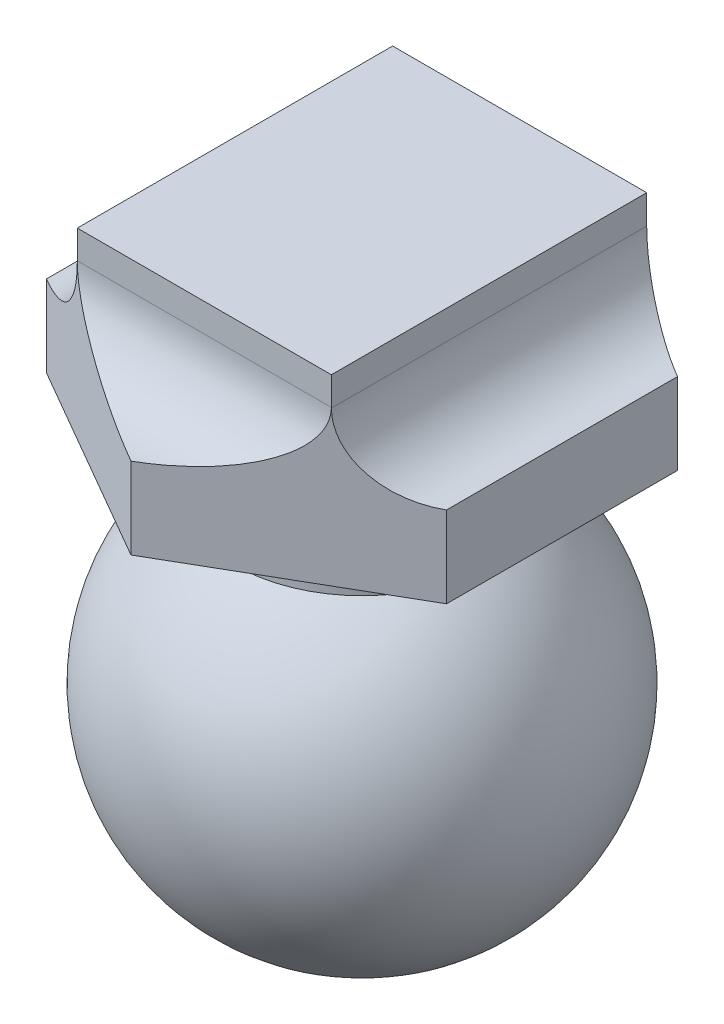
ISO-10303-21;
HEADER;
FILE_DESCRIPTION(('STEP AP214'),'2;1');
FILE_NAME('part.step','',(''),(''),'','','');
FILE_SCHEMA(('AUTOMOTIVE_DESIGN { 1 0 10303 214 1 1 1 1 }'));
ENDSEC;
DATA;
#1=APPLICATION_CONTEXT('core data for automotive mechanical design processes');
#2=APPLICATION_PROTOCOL_DEFINITION('international standard','automotive_design',2000,#1);
#3=PRODUCT_CONTEXT('',#1,'mechanical');
#4=PRODUCT('Part','Part','',(#3));
#5=PRODUCT_RELATED_PRODUCT_CATEGORY('part','',(#4));
#6=PRODUCT_DEFINITION_FORMATION('','',#4);
#7=PRODUCT_DEFINITION_CONTEXT('part definition',#1,'design');
#8=PRODUCT_DEFINITION('design','',#6,#7);
#9=PRODUCT_DEFINITION_SHAPE('','',#8);
#10=(LENGTH_UNIT() NAMED_UNIT(*) SI_UNIT(.MILLI.,.METRE.));
#11=(NAMED_UNIT(*) PLANE_ANGLE_UNIT() SI_UNIT($,.RADIAN.));
#12=(NAMED_UNIT(*) SI_UNIT($,.STERADIAN.) SOLID_ANGLE_UNIT());
#13=UNCERTAINTY_MEASURE_WITH_UNIT(LENGTH_MEASURE(1.E-05),#10,'distance_accuracy_value','');
#14=(GEOMETRIC_REPRESENTATION_CONTEXT(3) GLOBAL_UNCERTAINTY_ASSIGNED_CONTEXT((#13)) GLOBAL_UNIT_ASSIGNED_CONTEXT((#10,
#11,#12)) REPRESENTATION_CONTEXT('',''));
#15=CARTESIAN_POINT('',(0.,0.,0.));
#16=DIRECTION('',(0.,0.,1.));
#17=DIRECTION('',(1.,0.,0.));
#18=AXIS2_PLACEMENT_3D('',#15,#16,#17);
#19=CARTESIAN_POINT('',(3.175,2.54,3.9404155872192));
#20=DIRECTION('',(-1.,0.,0.));
#21=DIRECTION('',(0.,0.,1.));
#22=AXIS2_PLACEMENT_3D('',#19,#20,#21);
#23=PLANE('',#22);
#24=DIRECTION('',(0.,0.,-1.));
#25=VECTOR('',#24,1.);
#26=CARTESIAN_POINT('',(3.17499999999999,1.81694857353043,6.18803279212225));
#27=LINE('',#26,#25);
#28=CARTESIAN_POINT('',(3.175,1.81694857353043,3.9404155872192));
#29=VERTEX_POINT('',#28);
#30=CARTESIAN_POINT('',(3.17499999999999,1.81694857353043,-3.9404155872192));
#31=VERTEX_POINT('',#30);
#32=EDGE_CURVE('E159',#29,#31,#27,.T.);
#33=ORIENTED_EDGE('',*,*,#32,.T.);
#34=DIRECTION('',(0.,1.,0.));
#35=VECTOR('',#34,1.);
#36=CARTESIAN_POINT('',(3.175,1.83308710467706,-3.94041558721919));
#37=LINE('',#36,#35);
#38=CARTESIAN_POINT('',(3.175,1.83308710467706,-3.94041558721919));
#39=VERTEX_POINT('',#38);
#40=EDGE_CURVE('E146',#31,#39,#37,.T.);
#41=ORIENTED_EDGE('',*,*,#40,.T.);
#42=DIRECTION('',(0.,-1.,0.));
#43=VECTOR('',#42,1.);
#44=CARTESIAN_POINT('',(3.175,2.54,-3.94041558721919));
#45=LINE('',#44,#43);
#46=CARTESIAN_POINT('',(3.175,2.54,-3.94041558721919));
#47=VERTEX_POINT('',#46);
#48=EDGE_CURVE('E232',#47,#39,#45,.T.);
#49=ORIENTED_EDGE('',*,*,#48,.F.);
#50=DIRECTION('',(0.,0.,-1.));
#51=VECTOR('',#50,1.);
#52=CARTESIAN_POINT('',(3.175,2.54,3.9404155872192));
#53=LINE('',#52,#51);
#54=CARTESIAN_POINT('',(3.175,2.54,3.9404155872192));
#55=VERTEX_POINT('',#54);
#56=EDGE_CURVE('E204',#55,#47,#53,.T.);
#57=ORIENTED_EDGE('',*,*,#56,.F.);
#58=DIRECTION('',(0.,-1.,0.));
#59=VECTOR('',#58,1.);
#60=CARTESIAN_POINT('',(3.175,2.54,3.9404155872192));
#61=LINE('',#60,#59);
#62=CARTESIAN_POINT('',(3.175,1.83308710467706,3.9404155872192));
#63=VERTEX_POINT('',#62);
#64=EDGE_CURVE('E221',#55,#63,#61,.T.);
#65=ORIENTED_EDGE('',*,*,#64,.T.);
#66=DIRECTION('',(0.,1.,0.));
#67=VECTOR('',#66,1.);
#68=CARTESIAN_POINT('',(3.175,1.83308710467706,3.9404155872192));
#69=LINE('',#68,#67);
#70=EDGE_CURVE('E62',#29,#63,#69,.T.);
#71=ORIENTED_EDGE('',*,*,#70,.F.);
#72=EDGE_LOOP('',(#33,#41,#49,#57,#65,#71));
#73=FACE_BOUND('',#72,.T.);
#74=ADVANCED_FACE('F44',(#73),#23,.F.);
#75=CARTESIAN_POINT('',(-3.175,2.54,3.9404155872192));
#76=DIRECTION('',(1.,0.,0.));
#77=DIRECTION('',(0.,0.,-1.));
#78=AXIS2_PLACEMENT_3D('',#75,#76,#77);
#79=PLANE('',#78);
#80=DIRECTION('',(0.,0.,-1.));
#81=VECTOR('',#80,1.);
#82=CARTESIAN_POINT('',(-3.175,1.81694857353042,6.18803279212224));
#83=LINE('',#82,#81);
#84=CARTESIAN_POINT('',(-3.175,1.81694857353042,3.9404155872192));
#85=VERTEX_POINT('',#84);
#86=CARTESIAN_POINT('',(-3.175,1.81694857353042,-3.94041558721919));
#87=VERTEX_POINT('',#86);
#88=EDGE_CURVE('E174',#85,#87,#83,.T.);
#89=ORIENTED_EDGE('',*,*,#88,.F.);
#90=DIRECTION('',(0.,1.,0.));
#91=VECTOR('',#90,1.);
#92=CARTESIAN_POINT('',(-3.175,1.83308710467706,3.9404155872192));
#93=LINE('',#92,#91);
#94=CARTESIAN_POINT('',(-3.175,1.83308710467706,3.9404155872192));
#95=VERTEX_POINT('',#94);
#96=EDGE_CURVE('E178',#85,#95,#93,.T.);
#97=ORIENTED_EDGE('',*,*,#96,.T.);
#98=DIRECTION('',(0.,-1.,0.));
#99=VECTOR('',#98,1.);
#100=CARTESIAN_POINT('',(-3.175,2.54,3.9404155872192));
#101=LINE('',#100,#99);
#102=CARTESIAN_POINT('',(-3.175,2.54,3.9404155872192));
#103=VERTEX_POINT('',#102);
#104=EDGE_CURVE('E224',#103,#95,#101,.T.);
#105=ORIENTED_EDGE('',*,*,#104,.F.);
#106=DIRECTION('',(0.,0.,1.));
#107=VECTOR('',#106,1.);
#108=CARTESIAN_POINT('',(-3.175,2.54,3.9404155872192));
#109=LINE('',#108,#107);
#110=CARTESIAN_POINT('',(-3.175,2.54,-3.94041558721919));
#111=VERTEX_POINT('',#110);
#112=EDGE_CURVE('E215',#111,#103,#109,.T.);
#113=ORIENTED_EDGE('',*,*,#112,.F.);
#114=DIRECTION('',(0.,-1.,0.));
#115=VECTOR('',#114,1.);
#116=CARTESIAN_POINT('',(-3.175,2.54,-3.94041558721919));
#117=LINE('',#116,#115);
#118=CARTESIAN_POINT('',(-3.175,1.83308710467706,-3.94041558721919));
#119=VERTEX_POINT('',#118);
#120=EDGE_CURVE('E228',#111,#119,#117,.T.);
#121=ORIENTED_EDGE('',*,*,#120,.T.);
#122=DIRECTION('',(0.,1.,0.));
#123=VECTOR('',#122,1.);
#124=CARTESIAN_POINT('',(-3.175,1.83308710467706,-3.94041558721919));
#125=LINE('',#124,#123);
#126=EDGE_CURVE('E200',#87,#119,#125,.T.);
#127=ORIENTED_EDGE('',*,*,#126,.F.);
#128=EDGE_LOOP('',(#89,#97,#105,#113,#121,#127));
#129=FACE_BOUND('',#128,.T.);
#130=ADVANCED_FACE('F318',(#129),#79,.F.);
#131=CARTESIAN_POINT('',(-3.175,2.54,-3.94041558721919));
#132=DIRECTION('',(0.,0.,1.));
#133=DIRECTION('',(1.,0.,0.));
#134=AXIS2_PLACEMENT_3D('',#131,#132,#133);
#135=PLANE('',#134);
#136=DIRECTION('',(-1.,0.,0.));
#137=VECTOR('',#136,1.);
#138=CARTESIAN_POINT('',(5.4760649666683,1.83308710467706,-3.94041558721919));
#139=LINE('',#138,#137);
#140=EDGE_CURVE('E156',#39,#119,#139,.T.);
#141=ORIENTED_EDGE('',*,*,#140,.T.);
#142=ORIENTED_EDGE('',*,*,#120,.F.);
#143=DIRECTION('',(-1.,0.,0.));
#144=VECTOR('',#143,1.);
#145=CARTESIAN_POINT('',(-3.175,2.54,-3.94041558721919));
#146=LINE('',#145,#144);
#147=EDGE_CURVE('E212',#47,#111,#146,.T.);
#148=ORIENTED_EDGE('',*,*,#147,.F.);
#149=ORIENTED_EDGE('',*,*,#48,.T.);
#150=EDGE_LOOP('',(#141,#142,#148,#149));
#151=FACE_BOUND('',#150,.T.);
#152=ADVANCED_FACE('F323',(#151),#135,.F.);
#153=CARTESIAN_POINT('',(0.,-11.2143559188741,0.));
#154=DIRECTION('',(0.,1.,0.));
#155=DIRECTION('',(0.,0.,1.));
#156=AXIS2_PLACEMENT_3D('',#153,#154,#155);
#157=TOROIDAL_SURFACE('',#156,2.286,1.016);
#158=CARTESIAN_POINT('',(0.,-12.0665602751375,0.));
#159=DIRECTION('',(0.,1.,0.));
#160=DIRECTION('',(0.,0.,1.));
#161=AXIS2_PLACEMENT_3D('',#158,#159,#160);
#162=CIRCLE('',#161,2.83917604355717);
#163=CARTESIAN_POINT('',(0.,-12.0665602751375,2.83917604355717));
#164=VERTEX_POINT('',#163);
#165=EDGE_CURVE('E261',#164,#164,#162,.T.);
#166=ORIENTED_EDGE('',*,*,#165,.F.);
#167=EDGE_LOOP('',(#166));
#168=FACE_BOUND('',#167,.T.);
#169=CARTESIAN_POINT('',(0.,-11.2143559188741,0.));
#170=DIRECTION('',(0.,-1.,0.));
#171=DIRECTION('',(0.,0.,1.));
#172=AXIS2_PLACEMENT_3D('',#169,#170,#171);
#173=CIRCLE('',#172,1.27);
#174=CARTESIAN_POINT('',(0.,-11.2143559188741,1.27));
#175=VERTEX_POINT('',#174);
#176=EDGE_CURVE('E12',#175,#175,#173,.T.);
#177=ORIENTED_EDGE('',*,*,#176,.F.);
#178=EDGE_LOOP('',(#177));
#179=FACE_BOUND('',#178,.T.);
#180=ADVANCED_FACE('F352',(#168,#179),#157,.T.);
#181=CARTESIAN_POINT('',(0.,8.11572290905674,0.));
#182=DIRECTION('',(0.,-1.,0.));
#183=DIRECTION('',(0.,0.,-1.));
#184=AXIS2_PLACEMENT_3D('',#181,#182,#183);
#185=CYLINDRICAL_SURFACE('',#184,1.27);
#186=ORIENTED_EDGE('',*,*,#176,.T.);
#187=EDGE_LOOP('',(#186));
#188=FACE_BOUND('',#187,.T.);
#189=CARTESIAN_POINT('',(0.,0.,0.));
#190=DIRECTION('',(0.,-1.,0.));
#191=DIRECTION('',(0.,0.,1.));
#192=AXIS2_PLACEMENT_3D('',#189,#190,#191);
#193=CIRCLE('',#192,1.27);
#194=CARTESIAN_POINT('',(0.,0.,1.27));
#195=VERTEX_POINT('',#194);
#196=EDGE_CURVE('E235',#195,#195,#193,.T.);
#197=ORIENTED_EDGE('',*,*,#196,.F.);
#198=EDGE_LOOP('',(#197));
#199=FACE_BOUND('',#198,.T.);
#200=ADVANCED_FACE('F348',(#188,#199),#185,.F.);
#201=CARTESIAN_POINT('',(0.,-12.9072414166153,0.));
#202=DIRECTION('',(0.,1.,0.));
#203=DIRECTION('',(-1.,0.,0.));
#204=AXIS2_PLACEMENT_3D('',#201,#202,#203);
#205=CYLINDRICAL_SURFACE('',#204,3.175);
#206=CARTESIAN_POINT('',(0.,-2.032,0.));
#207=DIRECTION('',(0.,1.,0.));
#208=DIRECTION('',(0.,0.,-1.));
#209=AXIS2_PLACEMENT_3D('',#206,#207,#208);
#210=CIRCLE('',#209,3.175);
#211=CARTESIAN_POINT('',(0.,-2.032,-3.175));
#212=VERTEX_POINT('',#211);
#213=EDGE_CURVE('E247',#212,#212,#210,.T.);
#214=ORIENTED_EDGE('',*,*,#213,.F.);
#215=EDGE_LOOP('',(#214));
#216=FACE_BOUND('',#215,.T.);
#217=CARTESIAN_POINT('',(0.,-3.556,0.));
#218=DIRECTION('',(0.,1.,0.));
#219=DIRECTION('',(-1.,0.,0.));
#220=AXIS2_PLACEMENT_3D('',#217,#218,#219);
#221=CIRCLE('',#220,3.175);
#222=CARTESIAN_POINT('',(-3.175,-3.556,0.));
#223=VERTEX_POINT('',#222);
#224=EDGE_CURVE('E54',#223,#223,#221,.T.);
#225=ORIENTED_EDGE('',*,*,#224,.T.);
#226=EDGE_LOOP('',(#225));
#227=FACE_BOUND('',#226,.T.);
#228=ADVANCED_FACE('F351',(#216,#227),#205,.T.);
#229=CARTESIAN_POINT('',(0.,-7.69262141661526,0.));
#230=DIRECTION('',(0.,0.,-1.));
#231=DIRECTION('',(1.,0.,0.));
#232=AXIS2_PLACEMENT_3D('',#229,#230,#231);
#233=SPHERICAL_SURFACE('',#232,5.21462);
#234=CARTESIAN_POINT('',(0.,-7.69262141661526,0.));
#235=DIRECTION('',(0.,1.,0.));
#236=DIRECTION('',(-1.,0.,0.));
#237=AXIS2_PLACEMENT_3D('',#234,#235,#236);
#238=SPHERICAL_SURFACE('',#237,5.21462);
#239=ORIENTED_EDGE('',*,*,#224,.F.);
#240=EDGE_LOOP('',(#239));
#241=FACE_BOUND('',#240,.T.);
#242=ORIENTED_EDGE('',*,*,#165,.T.);
#243=EDGE_LOOP('',(#242));
#244=FACE_BOUND('',#243,.T.);
#245=ADVANCED_FACE('F363',(#241,#244),#238,.T.);
#246=CARTESIAN_POINT('',(5.,-2.032,2.88675134594813));
#247=DIRECTION('',(-0.5,0.,-0.866025403784439));
#248=DIRECTION('',(-0.866025403784439,0.,0.5));
#249=AXIS2_PLACEMENT_3D('',#246,#247,#248);
#250=PLANE('',#249);
#251=DIRECTION('',(0.,1.,0.));
#252=VECTOR('',#251,1.);
#253=CARTESIAN_POINT('',(5.,-2.032,2.88675134594813));
#254=LINE('',#253,#252);
#255=CARTESIAN_POINT('',(5.,-2.032,2.88675134594813));
#256=VERTEX_POINT('',#255);
#257=CARTESIAN_POINT('',(5.,0.,2.88675134594813));
#258=VERTEX_POINT('',#257);
#259=EDGE_CURVE('E256',#256,#258,#254,.T.);
#260=ORIENTED_EDGE('',*,*,#259,.T.);
#261=CARTESIAN_POINT('',(5.,1.82501783910375,2.88675134594813));
#262=DIRECTION('',(-0.5,0.,-0.866025403784439));
#263=DIRECTION('',(0.866025403784439,0.,-0.5));
#264=AXIS2_PLACEMENT_3D('',#261,#262,#263);
#265=ELLIPSE('',#264,2.10734908136483,1.82501783910375);
#266=EDGE_CURVE('E163',#29,#258,#265,.F.);
#267=ORIENTED_EDGE('',*,*,#266,.F.);
#268=ORIENTED_EDGE('',*,*,#70,.T.);
#269=CARTESIAN_POINT('',(0.,1.83308710467706,5.77350269189626));
#270=DIRECTION('',(-0.5,0.,-0.866025403784439));
#271=DIRECTION('',(-0.866025403784439,0.,0.5));
#272=AXIS2_PLACEMENT_3D('',#269,#270,#271);
#273=ELLIPSE('',#272,3.66617420935412,1.83308710467706);
#274=CARTESIAN_POINT('',(0.,0.,5.77350269189626));
#275=VERTEX_POINT('',#274);
#276=EDGE_CURVE('E188',#63,#275,#273,.T.);
#277=ORIENTED_EDGE('',*,*,#276,.T.);
#278=DIRECTION('',(0.,1.,0.));
#279=VECTOR('',#278,1.);
#280=CARTESIAN_POINT('',(0.,-2.032,5.77350269189626));
#281=LINE('',#280,#279);
#282=CARTESIAN_POINT('',(0.,-2.032,5.77350269189626));
#283=VERTEX_POINT('',#282);
#284=EDGE_CURVE('E260',#283,#275,#281,.T.);
#285=ORIENTED_EDGE('',*,*,#284,.F.);
#286=DIRECTION('',(-0.866025403784439,0.,0.5));
#287=VECTOR('',#286,1.);
#288=CARTESIAN_POINT('',(5.,-2.032,2.88675134594813));
#289=LINE('',#288,#287);
#290=EDGE_CURVE('E236',#256,#283,#289,.T.);
#291=ORIENTED_EDGE('',*,*,#290,.F.);
#292=EDGE_LOOP('',(#260,#267,#268,#277,#285,#291));
#293=FACE_BOUND('',#292,.T.);
#294=ADVANCED_FACE('F360',(#293),#250,.F.);
#295=CARTESIAN_POINT('',(0.,-2.032,5.77350269189626));
#296=DIRECTION('',(0.5,0.,-0.866025403784439));
#297=DIRECTION('',(0.,-1.,0.));
#298=AXIS2_PLACEMENT_3D('',#295,#296,#297);
#299=PLANE('',#298);
#300=CARTESIAN_POINT('',(-5.,1.82501783910374,2.88675134594813));
#301=DIRECTION('',(0.5,0.,-0.866025403784439));
#302=DIRECTION('',(-0.866025403784439,0.,-0.5));
#303=AXIS2_PLACEMENT_3D('',#300,#301,#302);
#304=ELLIPSE('',#303,2.10734908136483,1.82501783910374);
#305=CARTESIAN_POINT('',(-5.,0.,2.88675134594813));
#306=VERTEX_POINT('',#305);
#307=EDGE_CURVE('E175',#306,#85,#304,.F.);
#308=ORIENTED_EDGE('',*,*,#307,.F.);
#309=DIRECTION('',(0.,1.,0.));
#310=VECTOR('',#309,1.);
#311=CARTESIAN_POINT('',(-5.,-2.032,2.88675134594813));
#312=LINE('',#311,#310);
#313=CARTESIAN_POINT('',(-5.,-2.032,2.88675134594813));
#314=VERTEX_POINT('',#313);
#315=EDGE_CURVE('E241',#314,#306,#312,.T.);
#316=ORIENTED_EDGE('',*,*,#315,.F.);
#317=DIRECTION('',(-0.866025403784439,0.,-0.5));
#318=VECTOR('',#317,1.);
#319=CARTESIAN_POINT('',(0.,-2.032,5.77350269189626));
#320=LINE('',#319,#318);
#321=EDGE_CURVE('E239',#283,#314,#320,.T.);
#322=ORIENTED_EDGE('',*,*,#321,.F.);
#323=ORIENTED_EDGE('',*,*,#284,.T.);
#324=CARTESIAN_POINT('',(0.,1.83308710467706,5.77350269189626));
#325=DIRECTION('',(0.5,0.,-0.866025403784439));
#326=DIRECTION('',(0.866025403784439,0.,0.5));
#327=AXIS2_PLACEMENT_3D('',#324,#325,#326);
#328=ELLIPSE('',#327,3.66617420935412,1.83308710467706);
#329=EDGE_CURVE('E183',#95,#275,#328,.F.);
#330=ORIENTED_EDGE('',*,*,#329,.F.);
#331=ORIENTED_EDGE('',*,*,#96,.F.);
#332=EDGE_LOOP('',(#308,#316,#322,#323,#330,#331));
#333=FACE_BOUND('',#332,.T.);
#334=ADVANCED_FACE('F311',(#333),#299,.F.);
#335=CARTESIAN_POINT('',(-5.,-2.032,2.88675134594813));
#336=DIRECTION('',(1.,0.,0.));
#337=DIRECTION('',(0.,0.,1.));
#338=AXIS2_PLACEMENT_3D('',#335,#336,#337);
#339=PLANE('',#338);
#340=ORIENTED_EDGE('',*,*,#315,.T.);
#341=DIRECTION('',(0.,0.,-1.));
#342=VECTOR('',#341,1.);
#343=CARTESIAN_POINT('',(-5.,0.,2.88675134594813));
#344=LINE('',#343,#342);
#345=CARTESIAN_POINT('',(-5.,0.,-2.88675134594813));
#346=VERTEX_POINT('',#345);
#347=EDGE_CURVE('E246',#306,#346,#344,.T.);
#348=ORIENTED_EDGE('',*,*,#347,.T.);
#349=DIRECTION('',(0.,1.,0.));
#350=VECTOR('',#349,1.);
#351=CARTESIAN_POINT('',(-5.,-2.032,-2.88675134594813));
#352=LINE('',#351,#350);
#353=CARTESIAN_POINT('',(-5.,-2.032,-2.88675134594813));
#354=VERTEX_POINT('',#353);
#355=EDGE_CURVE('E245',#354,#346,#352,.T.);
#356=ORIENTED_EDGE('',*,*,#355,.F.);
#357=DIRECTION('',(0.,0.,-1.));
#358=VECTOR('',#357,1.);
#359=CARTESIAN_POINT('',(-5.,-2.032,2.88675134594813));
#360=LINE('',#359,#358);
#361=EDGE_CURVE('E265',#314,#354,#360,.T.);
#362=ORIENTED_EDGE('',*,*,#361,.F.);
#363=EDGE_LOOP('',(#340,#348,#356,#362));
#364=FACE_BOUND('',#363,.T.);
#365=ADVANCED_FACE('F296',(#364),#339,.F.);
#366=CARTESIAN_POINT('',(-5.,-2.032,-2.88675134594813));
#367=DIRECTION('',(0.5,0.,0.866025403784439));
#368=DIRECTION('',(0.,-1.,0.));
#369=AXIS2_PLACEMENT_3D('',#366,#367,#368);
#370=PLANE('',#369);
#371=ORIENTED_EDGE('',*,*,#355,.T.);
#372=CARTESIAN_POINT('',(-5.,1.82501783910374,-2.88675134594813));
#373=DIRECTION('',(0.5,0.,0.866025403784439));
#374=DIRECTION('',(-0.866025403784439,0.,0.5));
#375=AXIS2_PLACEMENT_3D('',#372,#373,#374);
#376=ELLIPSE('',#375,2.10734908136483,1.82501783910374);
#377=EDGE_CURVE('E70',#346,#87,#376,.T.);
#378=ORIENTED_EDGE('',*,*,#377,.T.);
#379=ORIENTED_EDGE('',*,*,#126,.T.);
#380=CARTESIAN_POINT('',(0.,1.83308710467706,-5.77350269189626));
#381=DIRECTION('',(0.5,0.,0.866025403784439));
#382=DIRECTION('',(0.866025403784439,0.,-0.5));
#383=AXIS2_PLACEMENT_3D('',#380,#381,#382);
#384=ELLIPSE('',#383,3.66617420935412,1.83308710467706);
#385=CARTESIAN_POINT('',(0.,0.,-5.77350269189626));
#386=VERTEX_POINT('',#385);
#387=EDGE_CURVE('E191',#386,#119,#384,.F.);
#388=ORIENTED_EDGE('',*,*,#387,.F.);
#389=DIRECTION('',(0.,1.,0.));
#390=VECTOR('',#389,1.);
#391=CARTESIAN_POINT('',(0.,-2.032,-5.77350269189626));
#392=LINE('',#391,#390);
#393=CARTESIAN_POINT('',(0.,-2.032,-5.77350269189626));
#394=VERTEX_POINT('',#393);
#395=EDGE_CURVE('E284',#394,#386,#392,.T.);
#396=ORIENTED_EDGE('',*,*,#395,.F.);
#397=DIRECTION('',(0.866025403784439,0.,-0.5));
#398=VECTOR('',#397,1.);
#399=CARTESIAN_POINT('',(-5.,-2.032,-2.88675134594813));
#400=LINE('',#399,#398);
#401=EDGE_CURVE('E264',#354,#394,#400,.T.);
#402=ORIENTED_EDGE('',*,*,#401,.F.);
#403=EDGE_LOOP('',(#371,#378,#379,#388,#396,#402));
#404=FACE_BOUND('',#403,.T.);
#405=ADVANCED_FACE('F301',(#404),#370,.F.);
#406=CARTESIAN_POINT('',(0.,-2.032,-5.77350269189626));
#407=DIRECTION('',(-0.5,0.,0.866025403784439));
#408=DIRECTION('',(0.,1.,0.));
#409=AXIS2_PLACEMENT_3D('',#406,#407,#408);
#410=PLANE('',#409);
#411=CARTESIAN_POINT('',(5.,1.82501783910375,-2.88675134594813));
#412=DIRECTION('',(-0.5,0.,0.866025403784439));
#413=DIRECTION('',(0.866025403784439,0.,0.5));
#414=AXIS2_PLACEMENT_3D('',#411,#412,#413);
#415=ELLIPSE('',#414,2.10734908136483,1.82501783910375);
#416=CARTESIAN_POINT('',(5.,0.,-2.88675134594813));
#417=VERTEX_POINT('',#416);
#418=EDGE_CURVE('E149',#31,#417,#415,.T.);
#419=ORIENTED_EDGE('',*,*,#418,.T.);
#420=DIRECTION('',(0.,1.,0.));
#421=VECTOR('',#420,1.);
#422=CARTESIAN_POINT('',(5.,-2.032,-2.88675134594813));
#423=LINE('',#422,#421);
#424=CARTESIAN_POINT('',(5.,-2.032,-2.88675134594813));
#425=VERTEX_POINT('',#424);
#426=EDGE_CURVE('E240',#425,#417,#423,.T.);
#427=ORIENTED_EDGE('',*,*,#426,.F.);
#428=DIRECTION('',(0.866025403784439,0.,0.5));
#429=VECTOR('',#428,1.);
#430=CARTESIAN_POINT('',(0.,-2.032,-5.77350269189626));
#431=LINE('',#430,#429);
#432=EDGE_CURVE('E255',#394,#425,#431,.T.);
#433=ORIENTED_EDGE('',*,*,#432,.F.);
#434=ORIENTED_EDGE('',*,*,#395,.T.);
#435=CARTESIAN_POINT('',(0.,1.83308710467706,-5.77350269189626));
#436=DIRECTION('',(-0.5,0.,0.866025403784439));
#437=DIRECTION('',(-0.866025403784439,0.,-0.5));
#438=AXIS2_PLACEMENT_3D('',#435,#436,#437);
#439=ELLIPSE('',#438,3.66617420935412,1.83308710467706);
#440=EDGE_CURVE('E151',#386,#39,#439,.T.);
#441=ORIENTED_EDGE('',*,*,#440,.T.);
#442=ORIENTED_EDGE('',*,*,#40,.F.);
#443=EDGE_LOOP('',(#419,#427,#433,#434,#441,#442));
#444=FACE_BOUND('',#443,.T.);
#445=ADVANCED_FACE('F46',(#444),#410,.F.);
#446=CARTESIAN_POINT('',(5.,-2.032,-2.88675134594813));
#447=DIRECTION('',(-1.,0.,0.));
#448=DIRECTION('',(0.,0.,1.));
#449=AXIS2_PLACEMENT_3D('',#446,#447,#448);
#450=PLANE('',#449);
#451=ORIENTED_EDGE('',*,*,#426,.T.);
#452=DIRECTION('',(0.,0.,1.));
#453=VECTOR('',#452,1.);
#454=CARTESIAN_POINT('',(5.,0.,-2.88675134594813));
#455=LINE('',#454,#453);
#456=EDGE_CURVE('E48',#417,#258,#455,.T.);
#457=ORIENTED_EDGE('',*,*,#456,.T.);
#458=ORIENTED_EDGE('',*,*,#259,.F.);
#459=DIRECTION('',(0.,0.,1.));
#460=VECTOR('',#459,1.);
#461=CARTESIAN_POINT('',(5.,-2.032,-2.88675134594813));
#462=LINE('',#461,#460);
#463=EDGE_CURVE('E251',#425,#256,#462,.T.);
#464=ORIENTED_EDGE('',*,*,#463,.F.);
#465=EDGE_LOOP('',(#451,#457,#458,#464));
#466=FACE_BOUND('',#465,.T.);
#467=ADVANCED_FACE('F354',(#466),#450,.F.);
#468=CARTESIAN_POINT('',(0.,-2.032,0.));
#469=DIRECTION('',(0.,-1.,0.));
#470=DIRECTION('',(0.,0.,-1.));
#471=AXIS2_PLACEMENT_3D('',#468,#469,#470);
#472=PLANE('',#471);
#473=ORIENTED_EDGE('',*,*,#290,.T.);
#474=ORIENTED_EDGE('',*,*,#321,.T.);
#475=ORIENTED_EDGE('',*,*,#361,.T.);
#476=ORIENTED_EDGE('',*,*,#401,.T.);
#477=ORIENTED_EDGE('',*,*,#432,.T.);
#478=ORIENTED_EDGE('',*,*,#463,.T.);
#479=EDGE_LOOP('',(#473,#474,#475,#476,#477,#478));
#480=FACE_BOUND('',#479,.T.);
#481=ORIENTED_EDGE('',*,*,#213,.T.);
#482=EDGE_LOOP('',(#481));
#483=FACE_BOUND('',#482,.T.);
#484=ADVANCED_FACE('F306',(#480,#483),#472,.T.);
#485=CARTESIAN_POINT('',(0.,2.54,0.));
#486=DIRECTION('',(0.,-1.,0.));
#487=DIRECTION('',(0.,0.,-1.));
#488=AXIS2_PLACEMENT_3D('',#485,#486,#487);
#489=PLANE('',#488);
#490=ORIENTED_EDGE('',*,*,#56,.T.);
#491=ORIENTED_EDGE('',*,*,#147,.T.);
#492=ORIENTED_EDGE('',*,*,#112,.T.);
#493=DIRECTION('',(1.,0.,0.));
#494=VECTOR('',#493,1.);
#495=CARTESIAN_POINT('',(-3.175,2.54,3.9404155872192));
#496=LINE('',#495,#494);
#497=EDGE_CURVE('E218',#103,#55,#496,.T.);
#498=ORIENTED_EDGE('',*,*,#497,.T.);
#499=EDGE_LOOP('',(#490,#491,#492,#498));
#500=FACE_BOUND('',#499,.T.);
#501=ADVANCED_FACE('F378',(#500),#489,.F.);
#502=CARTESIAN_POINT('',(-3.175,2.54,3.9404155872192));
#503=DIRECTION('',(0.,0.,-1.));
#504=DIRECTION('',(-1.,0.,0.));
#505=AXIS2_PLACEMENT_3D('',#502,#503,#504);
#506=PLANE('',#505);
#507=ORIENTED_EDGE('',*,*,#104,.T.);
#508=DIRECTION('',(-1.,0.,0.));
#509=VECTOR('',#508,1.);
#510=CARTESIAN_POINT('',(5.47606496666829,1.83308710467706,3.9404155872192));
#511=LINE('',#510,#509);
#512=EDGE_CURVE('E187',#63,#95,#511,.T.);
#513=ORIENTED_EDGE('',*,*,#512,.F.);
#514=ORIENTED_EDGE('',*,*,#64,.F.);
#515=ORIENTED_EDGE('',*,*,#497,.F.);
#516=EDGE_LOOP('',(#507,#513,#514,#515));
#517=FACE_BOUND('',#516,.T.);
#518=ADVANCED_FACE('F336',(#517),#506,.F.);
#519=CARTESIAN_POINT('',(0.,0.,0.));
#520=DIRECTION('',(0.,-1.,0.));
#521=DIRECTION('',(0.,0.,-1.));
#522=AXIS2_PLACEMENT_3D('',#519,#520,#521);
#523=PLANE('',#522);
#524=ORIENTED_EDGE('',*,*,#196,.T.);
#525=EDGE_LOOP('',(#524));
#526=FACE_BOUND('',#525,.T.);
#527=ADVANCED_FACE('F328',(#526),#523,.T.);
#528=CARTESIAN_POINT('',(5.4760649666683,1.83308710467706,-5.77350269189626));
#529=DIRECTION('',(-1.,0.,0.));
#530=DIRECTION('',(0.,0.,1.));
#531=AXIS2_PLACEMENT_3D('',#528,#529,#530);
#532=CYLINDRICAL_SURFACE('',#531,1.83308710467706);
#533=ORIENTED_EDGE('',*,*,#440,.F.);
#534=ORIENTED_EDGE('',*,*,#387,.T.);
#535=ORIENTED_EDGE('',*,*,#140,.F.);
#536=EDGE_LOOP('',(#533,#534,#535));
#537=FACE_BOUND('',#536,.T.);
#538=ADVANCED_FACE('F325',(#537),#532,.F.);
#539=CARTESIAN_POINT('',(5.47606496666829,1.83308710467706,5.77350269189626));
#540=DIRECTION('',(-1.,0.,0.));
#541=DIRECTION('',(0.,0.,1.));
#542=AXIS2_PLACEMENT_3D('',#539,#540,#541);
#543=CYLINDRICAL_SURFACE('',#542,1.83308710467706);
#544=ORIENTED_EDGE('',*,*,#276,.F.);
#545=ORIENTED_EDGE('',*,*,#512,.T.);
#546=ORIENTED_EDGE('',*,*,#329,.T.);
#547=EDGE_LOOP('',(#544,#545,#546));
#548=FACE_BOUND('',#547,.T.);
#549=ADVANCED_FACE('F327',(#548),#543,.F.);
#550=CARTESIAN_POINT('',(-5.,1.82501783910374,6.18803279212224));
#551=DIRECTION('',(0.,0.,-1.));
#552=DIRECTION('',(-1.,0.,0.));
#553=AXIS2_PLACEMENT_3D('',#550,#551,#552);
#554=CYLINDRICAL_SURFACE('',#553,1.82501783910374);
#555=ORIENTED_EDGE('',*,*,#347,.F.);
#556=ORIENTED_EDGE('',*,*,#307,.T.);
#557=ORIENTED_EDGE('',*,*,#88,.T.);
#558=ORIENTED_EDGE('',*,*,#377,.F.);
#559=EDGE_LOOP('',(#555,#556,#557,#558));
#560=FACE_BOUND('',#559,.T.);
#561=ADVANCED_FACE('F315',(#560),#554,.F.);
#562=CARTESIAN_POINT('',(5.,1.82501783910375,6.18803279212225));
#563=DIRECTION('',(0.,0.,-1.));
#564=DIRECTION('',(-1.,0.,0.));
#565=AXIS2_PLACEMENT_3D('',#562,#563,#564);
#566=CYLINDRICAL_SURFACE('',#565,1.82501783910375);
#567=ORIENTED_EDGE('',*,*,#32,.F.);
#568=ORIENTED_EDGE('',*,*,#266,.T.);
#569=ORIENTED_EDGE('',*,*,#456,.F.);
#570=ORIENTED_EDGE('',*,*,#418,.F.);
#571=EDGE_LOOP('',(#567,#568,#569,#570));
#572=FACE_BOUND('',#571,.T.);
#573=ADVANCED_FACE('F166',(#572),#566,.F.);
#574=CLOSED_SHELL('',(#74,#130,#152,#180,#200,#228,#245,#294,#334,#365,#405,#445,#467,#484,#501,
#518,#527,#538,#549,#561,#573));
#575=MANIFOLD_SOLID_BREP('B2',#574);
#576=ADVANCED_BREP_SHAPE_REPRESENTATION('',(#18,#575),#14);
#577=SHAPE_DEFINITION_REPRESENTATION(#9,#576);
ENDSEC;
END-ISO-10303-21;
